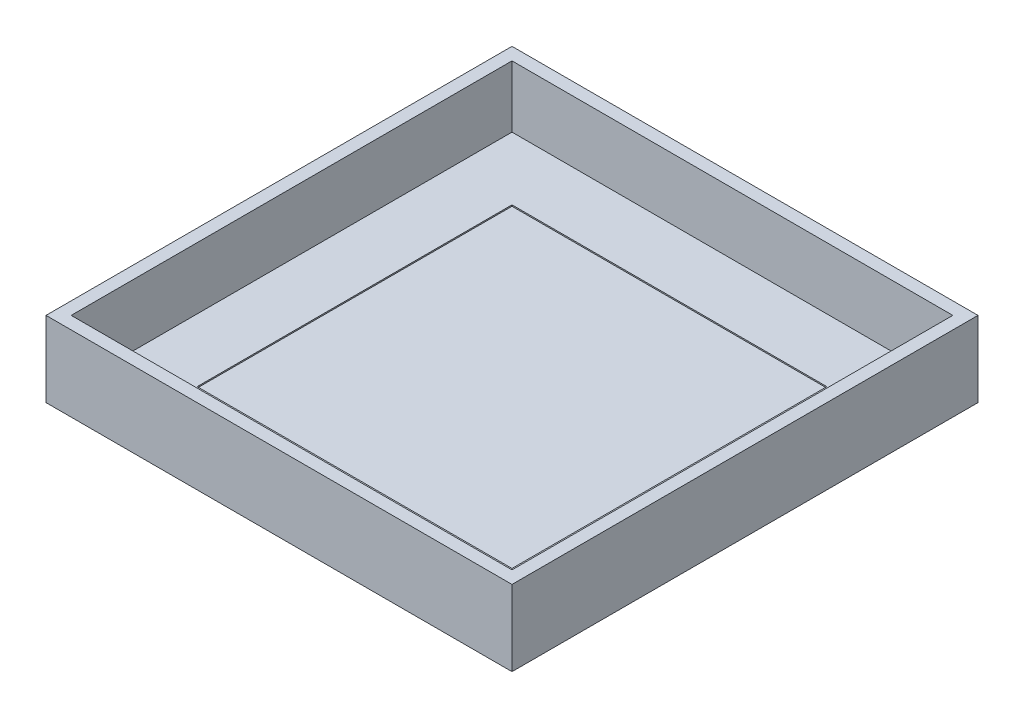
ISO-10303-21;
HEADER;
FILE_DESCRIPTION(('STEP AP214'),'2;1');
FILE_NAME('part.step','',(''),(''),'','','');
FILE_SCHEMA(('AUTOMOTIVE_DESIGN { 1 0 10303 214 1 1 1 1 }'));
ENDSEC;
DATA;
#1=APPLICATION_CONTEXT('core data for automotive mechanical design processes');
#2=APPLICATION_PROTOCOL_DEFINITION('international standard','automotive_design',2000,#1);
#3=PRODUCT_CONTEXT('',#1,'mechanical');
#4=PRODUCT('Part','Part','',(#3));
#5=PRODUCT_RELATED_PRODUCT_CATEGORY('part','',(#4));
#6=PRODUCT_DEFINITION_FORMATION('','',#4);
#7=PRODUCT_DEFINITION_CONTEXT('part definition',#1,'design');
#8=PRODUCT_DEFINITION('design','',#6,#7);
#9=PRODUCT_DEFINITION_SHAPE('','',#8);
#10=(LENGTH_UNIT() NAMED_UNIT(*) SI_UNIT(.MILLI.,.METRE.));
#11=(NAMED_UNIT(*) PLANE_ANGLE_UNIT() SI_UNIT($,.RADIAN.));
#12=(NAMED_UNIT(*) SI_UNIT($,.STERADIAN.) SOLID_ANGLE_UNIT());
#13=UNCERTAINTY_MEASURE_WITH_UNIT(LENGTH_MEASURE(1.E-05),#10,'distance_accuracy_value','');
#14=(GEOMETRIC_REPRESENTATION_CONTEXT(3) GLOBAL_UNCERTAINTY_ASSIGNED_CONTEXT((#13)) GLOBAL_UNIT_ASSIGNED_CONTEXT((#10,
#11,#12)) REPRESENTATION_CONTEXT('',''));
#15=CARTESIAN_POINT('',(0.,0.,0.));
#16=DIRECTION('',(0.,0.,1.));
#17=DIRECTION('',(1.,0.,0.));
#18=AXIS2_PLACEMENT_3D('',#15,#16,#17);
#19=CARTESIAN_POINT('',(0.,50.,0.));
#20=DIRECTION('',(0.,1.,0.));
#21=DIRECTION('',(0.,0.,1.));
#22=AXIS2_PLACEMENT_3D('',#19,#20,#21);
#23=PLANE('',#22);
#24=DIRECTION('',(0.,0.,-1.));
#25=VECTOR('',#24,1.);
#26=CARTESIAN_POINT('',(185.,50.,-185.));
#27=LINE('',#26,#25);
#28=CARTESIAN_POINT('',(185.,50.,185.));
#29=VERTEX_POINT('',#28);
#30=CARTESIAN_POINT('',(185.,50.,-185.));
#31=VERTEX_POINT('',#30);
#32=EDGE_CURVE('E238',#29,#31,#27,.T.);
#33=ORIENTED_EDGE('',*,*,#32,.T.);
#34=DIRECTION('',(-1.,0.,0.));
#35=VECTOR('',#34,1.);
#36=CARTESIAN_POINT('',(-185.,50.,-185.));
#37=LINE('',#36,#35);
#38=CARTESIAN_POINT('',(-185.,50.,-185.));
#39=VERTEX_POINT('',#38);
#40=EDGE_CURVE('E242',#31,#39,#37,.T.);
#41=ORIENTED_EDGE('',*,*,#40,.T.);
#42=DIRECTION('',(0.,0.,1.));
#43=VECTOR('',#42,1.);
#44=CARTESIAN_POINT('',(-185.,50.,-185.));
#45=LINE('',#44,#43);
#46=CARTESIAN_POINT('',(-185.,50.,185.));
#47=VERTEX_POINT('',#46);
#48=EDGE_CURVE('E245',#39,#47,#45,.T.);
#49=ORIENTED_EDGE('',*,*,#48,.T.);
#50=DIRECTION('',(1.,0.,0.));
#51=VECTOR('',#50,1.);
#52=CARTESIAN_POINT('',(-185.,50.,185.));
#53=LINE('',#52,#51);
#54=EDGE_CURVE('E248',#47,#29,#53,.T.);
#55=ORIENTED_EDGE('',*,*,#54,.T.);
#56=EDGE_LOOP('',(#33,#41,#49,#55));
#57=FACE_BOUND('',#56,.T.);
#58=DIRECTION('',(-1.,0.,0.));
#59=VECTOR('',#58,1.);
#60=CARTESIAN_POINT('',(-175.,50.,-175.));
#61=LINE('',#60,#59);
#62=CARTESIAN_POINT('',(175.,50.,-175.));
#63=VERTEX_POINT('',#62);
#64=CARTESIAN_POINT('',(-175.,50.,-175.));
#65=VERTEX_POINT('',#64);
#66=EDGE_CURVE('E216',#63,#65,#61,.T.);
#67=ORIENTED_EDGE('',*,*,#66,.F.);
#68=DIRECTION('',(0.,0.,-1.));
#69=VECTOR('',#68,1.);
#70=CARTESIAN_POINT('',(175.,50.,-175.));
#71=LINE('',#70,#69);
#72=CARTESIAN_POINT('',(175.,50.,175.));
#73=VERTEX_POINT('',#72);
#74=EDGE_CURVE('E213',#73,#63,#71,.T.);
#75=ORIENTED_EDGE('',*,*,#74,.F.);
#76=DIRECTION('',(1.,0.,0.));
#77=VECTOR('',#76,1.);
#78=CARTESIAN_POINT('',(-175.,50.,175.));
#79=LINE('',#78,#77);
#80=CARTESIAN_POINT('',(-175.,50.,175.));
#81=VERTEX_POINT('',#80);
#82=EDGE_CURVE('E223',#81,#73,#79,.T.);
#83=ORIENTED_EDGE('',*,*,#82,.F.);
#84=DIRECTION('',(0.,0.,1.));
#85=VECTOR('',#84,1.);
#86=CARTESIAN_POINT('',(-175.,50.,-175.));
#87=LINE('',#86,#85);
#88=EDGE_CURVE('E219',#65,#81,#87,.T.);
#89=ORIENTED_EDGE('',*,*,#88,.F.);
#90=EDGE_LOOP('',(#67,#75,#83,#89));
#91=FACE_BOUND('',#90,.T.);
#92=ADVANCED_FACE('F39',(#57,#91),#23,.T.);
#93=CARTESIAN_POINT('',(185.,50.,-185.));
#94=DIRECTION('',(-1.,0.,0.));
#95=DIRECTION('',(0.,0.,1.));
#96=AXIS2_PLACEMENT_3D('',#93,#94,#95);
#97=PLANE('',#96);
#98=DIRECTION('',(0.,-1.,0.));
#99=VECTOR('',#98,1.);
#100=CARTESIAN_POINT('',(185.,50.,185.));
#101=LINE('',#100,#99);
#102=CARTESIAN_POINT('',(185.,-10.,185.));
#103=VERTEX_POINT('',#102);
#104=EDGE_CURVE('E251',#29,#103,#101,.T.);
#105=ORIENTED_EDGE('',*,*,#104,.T.);
#106=DIRECTION('',(0.,0.,1.));
#107=VECTOR('',#106,1.);
#108=CARTESIAN_POINT('',(185.,-10.,185.));
#109=LINE('',#108,#107);
#110=CARTESIAN_POINT('',(185.,-10.,-185.));
#111=VERTEX_POINT('',#110);
#112=EDGE_CURVE('E205',#111,#103,#109,.T.);
#113=ORIENTED_EDGE('',*,*,#112,.F.);
#114=DIRECTION('',(0.,-1.,0.));
#115=VECTOR('',#114,1.);
#116=CARTESIAN_POINT('',(185.,50.,-185.));
#117=LINE('',#116,#115);
#118=EDGE_CURVE('E11',#31,#111,#117,.T.);
#119=ORIENTED_EDGE('',*,*,#118,.F.);
#120=ORIENTED_EDGE('',*,*,#32,.F.);
#121=EDGE_LOOP('',(#105,#113,#119,#120));
#122=FACE_BOUND('',#121,.T.);
#123=ADVANCED_FACE('F41',(#122),#97,.F.);
#124=CARTESIAN_POINT('',(-185.,50.,-185.));
#125=DIRECTION('',(0.,0.,1.));
#126=DIRECTION('',(1.,0.,0.));
#127=AXIS2_PLACEMENT_3D('',#124,#125,#126);
#128=PLANE('',#127);
#129=ORIENTED_EDGE('',*,*,#118,.T.);
#130=DIRECTION('',(1.,0.,0.));
#131=VECTOR('',#130,1.);
#132=CARTESIAN_POINT('',(-185.,-10.,-185.));
#133=LINE('',#132,#131);
#134=CARTESIAN_POINT('',(-185.,-10.,-185.));
#135=VERTEX_POINT('',#134);
#136=EDGE_CURVE('E201',#135,#111,#133,.T.);
#137=ORIENTED_EDGE('',*,*,#136,.F.);
#138=DIRECTION('',(0.,-1.,0.));
#139=VECTOR('',#138,1.);
#140=CARTESIAN_POINT('',(-185.,50.,-185.));
#141=LINE('',#140,#139);
#142=EDGE_CURVE('E48',#39,#135,#141,.T.);
#143=ORIENTED_EDGE('',*,*,#142,.F.);
#144=ORIENTED_EDGE('',*,*,#40,.F.);
#145=EDGE_LOOP('',(#129,#137,#143,#144));
#146=FACE_BOUND('',#145,.T.);
#147=ADVANCED_FACE('F265',(#146),#128,.F.);
#148=CARTESIAN_POINT('',(-185.,50.,-185.));
#149=DIRECTION('',(1.,0.,0.));
#150=DIRECTION('',(0.,0.,-1.));
#151=AXIS2_PLACEMENT_3D('',#148,#149,#150);
#152=PLANE('',#151);
#153=ORIENTED_EDGE('',*,*,#142,.T.);
#154=DIRECTION('',(0.,0.,-1.));
#155=VECTOR('',#154,1.);
#156=CARTESIAN_POINT('',(-185.,-10.,185.));
#157=LINE('',#156,#155);
#158=CARTESIAN_POINT('',(-185.,-10.,185.));
#159=VERTEX_POINT('',#158);
#160=EDGE_CURVE('E197',#159,#135,#157,.T.);
#161=ORIENTED_EDGE('',*,*,#160,.F.);
#162=DIRECTION('',(0.,-1.,0.));
#163=VECTOR('',#162,1.);
#164=CARTESIAN_POINT('',(-185.,50.,185.));
#165=LINE('',#164,#163);
#166=EDGE_CURVE('E254',#47,#159,#165,.T.);
#167=ORIENTED_EDGE('',*,*,#166,.F.);
#168=ORIENTED_EDGE('',*,*,#48,.F.);
#169=EDGE_LOOP('',(#153,#161,#167,#168));
#170=FACE_BOUND('',#169,.T.);
#171=ADVANCED_FACE('F262',(#170),#152,.F.);
#172=CARTESIAN_POINT('',(-185.,50.,185.));
#173=DIRECTION('',(0.,0.,-1.));
#174=DIRECTION('',(-1.,0.,0.));
#175=AXIS2_PLACEMENT_3D('',#172,#173,#174);
#176=PLANE('',#175);
#177=ORIENTED_EDGE('',*,*,#166,.T.);
#178=DIRECTION('',(-1.,0.,0.));
#179=VECTOR('',#178,1.);
#180=CARTESIAN_POINT('',(-185.,-10.,185.));
#181=LINE('',#180,#179);
#182=EDGE_CURVE('E209',#103,#159,#181,.T.);
#183=ORIENTED_EDGE('',*,*,#182,.F.);
#184=ORIENTED_EDGE('',*,*,#104,.F.);
#185=ORIENTED_EDGE('',*,*,#54,.F.);
#186=EDGE_LOOP('',(#177,#183,#184,#185));
#187=FACE_BOUND('',#186,.T.);
#188=ADVANCED_FACE('F273',(#187),#176,.F.);
#189=CARTESIAN_POINT('',(175.,50.,-175.));
#190=DIRECTION('',(-1.,0.,0.));
#191=DIRECTION('',(0.,0.,1.));
#192=AXIS2_PLACEMENT_3D('',#189,#190,#191);
#193=PLANE('',#192);
#194=DIRECTION('',(0.,0.,-1.));
#195=VECTOR('',#194,1.);
#196=CARTESIAN_POINT('',(175.,1.,-175.));
#197=LINE('',#196,#195);
#198=CARTESIAN_POINT('',(175.,1.,175.));
#199=VERTEX_POINT('',#198);
#200=CARTESIAN_POINT('',(175.,1.,-175.));
#201=VERTEX_POINT('',#200);
#202=EDGE_CURVE('E191',#199,#201,#197,.T.);
#203=ORIENTED_EDGE('',*,*,#202,.F.);
#204=DIRECTION('',(0.,-1.,0.));
#205=VECTOR('',#204,1.);
#206=CARTESIAN_POINT('',(175.,50.,175.));
#207=LINE('',#206,#205);
#208=EDGE_CURVE('E226',#73,#199,#207,.T.);
#209=ORIENTED_EDGE('',*,*,#208,.F.);
#210=ORIENTED_EDGE('',*,*,#74,.T.);
#211=DIRECTION('',(0.,-1.,0.));
#212=VECTOR('',#211,1.);
#213=CARTESIAN_POINT('',(175.,50.,-175.));
#214=LINE('',#213,#212);
#215=EDGE_CURVE('E235',#63,#201,#214,.T.);
#216=ORIENTED_EDGE('',*,*,#215,.T.);
#217=EDGE_LOOP('',(#203,#209,#210,#216));
#218=FACE_BOUND('',#217,.T.);
#219=ADVANCED_FACE('F289',(#218),#193,.T.);
#220=CARTESIAN_POINT('',(-175.,50.,-175.));
#221=DIRECTION('',(0.,0.,1.));
#222=DIRECTION('',(1.,0.,0.));
#223=AXIS2_PLACEMENT_3D('',#220,#221,#222);
#224=PLANE('',#223);
#225=DIRECTION('',(-1.,0.,0.));
#226=VECTOR('',#225,1.);
#227=CARTESIAN_POINT('',(-175.,1.,-175.));
#228=LINE('',#227,#226);
#229=CARTESIAN_POINT('',(-175.,1.,-175.));
#230=VERTEX_POINT('',#229);
#231=EDGE_CURVE('E55',#201,#230,#228,.T.);
#232=ORIENTED_EDGE('',*,*,#231,.F.);
#233=ORIENTED_EDGE('',*,*,#215,.F.);
#234=ORIENTED_EDGE('',*,*,#66,.T.);
#235=DIRECTION('',(0.,-1.,0.));
#236=VECTOR('',#235,1.);
#237=CARTESIAN_POINT('',(-175.,50.,-175.));
#238=LINE('',#237,#236);
#239=EDGE_CURVE('E232',#65,#230,#238,.T.);
#240=ORIENTED_EDGE('',*,*,#239,.T.);
#241=EDGE_LOOP('',(#232,#233,#234,#240));
#242=FACE_BOUND('',#241,.T.);
#243=ADVANCED_FACE('F309',(#242),#224,.T.);
#244=CARTESIAN_POINT('',(-175.,50.,-175.));
#245=DIRECTION('',(1.,0.,0.));
#246=DIRECTION('',(0.,0.,-1.));
#247=AXIS2_PLACEMENT_3D('',#244,#245,#246);
#248=PLANE('',#247);
#249=DIRECTION('',(0.,0.,1.));
#250=VECTOR('',#249,1.);
#251=CARTESIAN_POINT('',(-175.,1.,-175.));
#252=LINE('',#251,#250);
#253=CARTESIAN_POINT('',(-175.,1.,175.));
#254=VERTEX_POINT('',#253);
#255=EDGE_CURVE('E63',#230,#254,#252,.T.);
#256=ORIENTED_EDGE('',*,*,#255,.F.);
#257=ORIENTED_EDGE('',*,*,#239,.F.);
#258=ORIENTED_EDGE('',*,*,#88,.T.);
#259=DIRECTION('',(0.,-1.,0.));
#260=VECTOR('',#259,1.);
#261=CARTESIAN_POINT('',(-175.,50.,175.));
#262=LINE('',#261,#260);
#263=EDGE_CURVE('E229',#81,#254,#262,.T.);
#264=ORIENTED_EDGE('',*,*,#263,.T.);
#265=EDGE_LOOP('',(#256,#257,#258,#264));
#266=FACE_BOUND('',#265,.T.);
#267=ADVANCED_FACE('F316',(#266),#248,.T.);
#268=CARTESIAN_POINT('',(-175.,50.,175.));
#269=DIRECTION('',(0.,0.,-1.));
#270=DIRECTION('',(-1.,0.,0.));
#271=AXIS2_PLACEMENT_3D('',#268,#269,#270);
#272=PLANE('',#271);
#273=DIRECTION('',(1.,0.,0.));
#274=VECTOR('',#273,1.);
#275=CARTESIAN_POINT('',(-175.,1.,175.));
#276=LINE('',#275,#274);
#277=EDGE_CURVE('E187',#254,#199,#276,.T.);
#278=ORIENTED_EDGE('',*,*,#277,.F.);
#279=ORIENTED_EDGE('',*,*,#263,.F.);
#280=ORIENTED_EDGE('',*,*,#82,.T.);
#281=ORIENTED_EDGE('',*,*,#208,.T.);
#282=EDGE_LOOP('',(#278,#279,#280,#281));
#283=FACE_BOUND('',#282,.T.);
#284=ADVANCED_FACE('F322',(#283),#272,.T.);
#285=CARTESIAN_POINT('',(0.,-10.,0.));
#286=DIRECTION('',(0.,-1.,0.));
#287=DIRECTION('',(0.,0.,-1.));
#288=AXIS2_PLACEMENT_3D('',#285,#286,#287);
#289=PLANE('',#288);
#290=ORIENTED_EDGE('',*,*,#160,.T.);
#291=ORIENTED_EDGE('',*,*,#136,.T.);
#292=ORIENTED_EDGE('',*,*,#112,.T.);
#293=ORIENTED_EDGE('',*,*,#182,.T.);
#294=EDGE_LOOP('',(#290,#291,#292,#293));
#295=FACE_BOUND('',#294,.T.);
#296=ADVANCED_FACE('F269',(#295),#289,.T.);
#297=CARTESIAN_POINT('',(0.,1.,0.));
#298=DIRECTION('',(0.,1.,0.));
#299=DIRECTION('',(0.,0.,1.));
#300=AXIS2_PLACEMENT_3D('',#297,#298,#299);
#301=PLANE('',#300);
#302=ORIENTED_EDGE('',*,*,#255,.T.);
#303=ORIENTED_EDGE('',*,*,#277,.T.);
#304=ORIENTED_EDGE('',*,*,#202,.T.);
#305=ORIENTED_EDGE('',*,*,#231,.T.);
#306=EDGE_LOOP('',(#302,#303,#304,#305));
#307=FACE_BOUND('',#306,.T.);
#308=DIRECTION('',(-1.,0.,0.));
#309=VECTOR('',#308,1.);
#310=CARTESIAN_POINT('',(-125.,1.,-125.));
#311=LINE('',#310,#309);
#312=CARTESIAN_POINT('',(125.,1.,-125.));
#313=VERTEX_POINT('',#312);
#314=CARTESIAN_POINT('',(-125.,1.,-125.));
#315=VERTEX_POINT('',#314);
#316=EDGE_CURVE('E143',#313,#315,#311,.T.);
#317=ORIENTED_EDGE('',*,*,#316,.F.);
#318=DIRECTION('',(0.,0.,-1.));
#319=VECTOR('',#318,1.);
#320=CARTESIAN_POINT('',(125.,1.,-125.));
#321=LINE('',#320,#319);
#322=CARTESIAN_POINT('',(125.,1.,125.));
#323=VERTEX_POINT('',#322);
#324=EDGE_CURVE('E132',#323,#313,#321,.T.);
#325=ORIENTED_EDGE('',*,*,#324,.F.);
#326=DIRECTION('',(1.,0.,0.));
#327=VECTOR('',#326,1.);
#328=CARTESIAN_POINT('',(-125.,1.,125.));
#329=LINE('',#328,#327);
#330=CARTESIAN_POINT('',(-125.,1.,125.));
#331=VERTEX_POINT('',#330);
#332=EDGE_CURVE('E161',#331,#323,#329,.T.);
#333=ORIENTED_EDGE('',*,*,#332,.F.);
#334=DIRECTION('',(0.,0.,1.));
#335=VECTOR('',#334,1.);
#336=CARTESIAN_POINT('',(-125.,1.,-125.));
#337=LINE('',#336,#335);
#338=EDGE_CURVE('E157',#315,#331,#337,.T.);
#339=ORIENTED_EDGE('',*,*,#338,.F.);
#340=EDGE_LOOP('',(#317,#325,#333,#339));
#341=FACE_BOUND('',#340,.T.);
#342=ADVANCED_FACE('F155',(#307,#341),#301,.T.);
#343=CARTESIAN_POINT('',(125.,1.,-125.));
#344=DIRECTION('',(-1.,0.,0.));
#345=DIRECTION('',(0.,0.,1.));
#346=AXIS2_PLACEMENT_3D('',#343,#344,#345);
#347=PLANE('',#346);
#348=DIRECTION('',(0.,0.,-1.));
#349=VECTOR('',#348,1.);
#350=CARTESIAN_POINT('',(125.,0.,-125.));
#351=LINE('',#350,#349);
#352=CARTESIAN_POINT('',(125.,0.,125.));
#353=VERTEX_POINT('',#352);
#354=CARTESIAN_POINT('',(125.,0.,-125.));
#355=VERTEX_POINT('',#354);
#356=EDGE_CURVE('E166',#353,#355,#351,.T.);
#357=ORIENTED_EDGE('',*,*,#356,.F.);
#358=DIRECTION('',(0.,-1.,0.));
#359=VECTOR('',#358,1.);
#360=CARTESIAN_POINT('',(125.,1.,125.));
#361=LINE('',#360,#359);
#362=EDGE_CURVE('E138',#323,#353,#361,.T.);
#363=ORIENTED_EDGE('',*,*,#362,.F.);
#364=ORIENTED_EDGE('',*,*,#324,.T.);
#365=DIRECTION('',(0.,-1.,0.));
#366=VECTOR('',#365,1.);
#367=CARTESIAN_POINT('',(125.,1.,-125.));
#368=LINE('',#367,#366);
#369=EDGE_CURVE('E136',#313,#355,#368,.T.);
#370=ORIENTED_EDGE('',*,*,#369,.T.);
#371=EDGE_LOOP('',(#357,#363,#364,#370));
#372=FACE_BOUND('',#371,.T.);
#373=ADVANCED_FACE('F135',(#372),#347,.T.);
#374=CARTESIAN_POINT('',(-125.,1.,-125.));
#375=DIRECTION('',(0.,0.,1.));
#376=DIRECTION('',(1.,0.,0.));
#377=AXIS2_PLACEMENT_3D('',#374,#375,#376);
#378=PLANE('',#377);
#379=DIRECTION('',(-1.,0.,0.));
#380=VECTOR('',#379,1.);
#381=CARTESIAN_POINT('',(-125.,0.,-125.));
#382=LINE('',#381,#380);
#383=CARTESIAN_POINT('',(-125.,0.,-125.));
#384=VERTEX_POINT('',#383);
#385=EDGE_CURVE('E150',#355,#384,#382,.T.);
#386=ORIENTED_EDGE('',*,*,#385,.F.);
#387=ORIENTED_EDGE('',*,*,#369,.F.);
#388=ORIENTED_EDGE('',*,*,#316,.T.);
#389=DIRECTION('',(0.,-1.,0.));
#390=VECTOR('',#389,1.);
#391=CARTESIAN_POINT('',(-125.,1.,-125.));
#392=LINE('',#391,#390);
#393=EDGE_CURVE('E152',#315,#384,#392,.T.);
#394=ORIENTED_EDGE('',*,*,#393,.T.);
#395=EDGE_LOOP('',(#386,#387,#388,#394));
#396=FACE_BOUND('',#395,.T.);
#397=ADVANCED_FACE('F147',(#396),#378,.T.);
#398=CARTESIAN_POINT('',(-125.,1.,-125.));
#399=DIRECTION('',(1.,0.,0.));
#400=DIRECTION('',(0.,0.,-1.));
#401=AXIS2_PLACEMENT_3D('',#398,#399,#400);
#402=PLANE('',#401);
#403=DIRECTION('',(0.,0.,1.));
#404=VECTOR('',#403,1.);
#405=CARTESIAN_POINT('',(-125.,0.,-125.));
#406=LINE('',#405,#404);
#407=CARTESIAN_POINT('',(-125.,0.,125.));
#408=VERTEX_POINT('',#407);
#409=EDGE_CURVE('E171',#384,#408,#406,.T.);
#410=ORIENTED_EDGE('',*,*,#409,.F.);
#411=ORIENTED_EDGE('',*,*,#393,.F.);
#412=ORIENTED_EDGE('',*,*,#338,.T.);
#413=DIRECTION('',(0.,-1.,0.));
#414=VECTOR('',#413,1.);
#415=CARTESIAN_POINT('',(-125.,1.,125.));
#416=LINE('',#415,#414);
#417=EDGE_CURVE('E180',#331,#408,#416,.T.);
#418=ORIENTED_EDGE('',*,*,#417,.T.);
#419=EDGE_LOOP('',(#410,#411,#412,#418));
#420=FACE_BOUND('',#419,.T.);
#421=ADVANCED_FACE('F354',(#420),#402,.T.);
#422=CARTESIAN_POINT('',(-125.,1.,125.));
#423=DIRECTION('',(0.,0.,-1.));
#424=DIRECTION('',(-1.,0.,0.));
#425=AXIS2_PLACEMENT_3D('',#422,#423,#424);
#426=PLANE('',#425);
#427=DIRECTION('',(1.,0.,0.));
#428=VECTOR('',#427,1.);
#429=CARTESIAN_POINT('',(-125.,0.,125.));
#430=LINE('',#429,#428);
#431=EDGE_CURVE('E144',#408,#353,#430,.T.);
#432=ORIENTED_EDGE('',*,*,#431,.F.);
#433=ORIENTED_EDGE('',*,*,#417,.F.);
#434=ORIENTED_EDGE('',*,*,#332,.T.);
#435=ORIENTED_EDGE('',*,*,#362,.T.);
#436=EDGE_LOOP('',(#432,#433,#434,#435));
#437=FACE_BOUND('',#436,.T.);
#438=ADVANCED_FACE('F361',(#437),#426,.T.);
#439=CARTESIAN_POINT('',(0.,0.,0.));
#440=DIRECTION('',(0.,-1.,0.));
#441=DIRECTION('',(0.,0.,-1.));
#442=AXIS2_PLACEMENT_3D('',#439,#440,#441);
#443=PLANE('',#442);
#444=ORIENTED_EDGE('',*,*,#431,.T.);
#445=ORIENTED_EDGE('',*,*,#356,.T.);
#446=ORIENTED_EDGE('',*,*,#385,.T.);
#447=ORIENTED_EDGE('',*,*,#409,.T.);
#448=EDGE_LOOP('',(#444,#445,#446,#447));
#449=FACE_BOUND('',#448,.T.);
#450=ADVANCED_FACE('F369',(#449),#443,.F.);
#451=CLOSED_SHELL('',(#92,#123,#147,#171,#188,#219,#243,#267,#284,#296,#342,#373,#397,#421,#438,#450));
#452=MANIFOLD_SOLID_BREP('B2',#451);
#453=ADVANCED_BREP_SHAPE_REPRESENTATION('',(#18,#452),#14);
#454=SHAPE_DEFINITION_REPRESENTATION(#9,#453);
ENDSEC;
END-ISO-10303-21;
